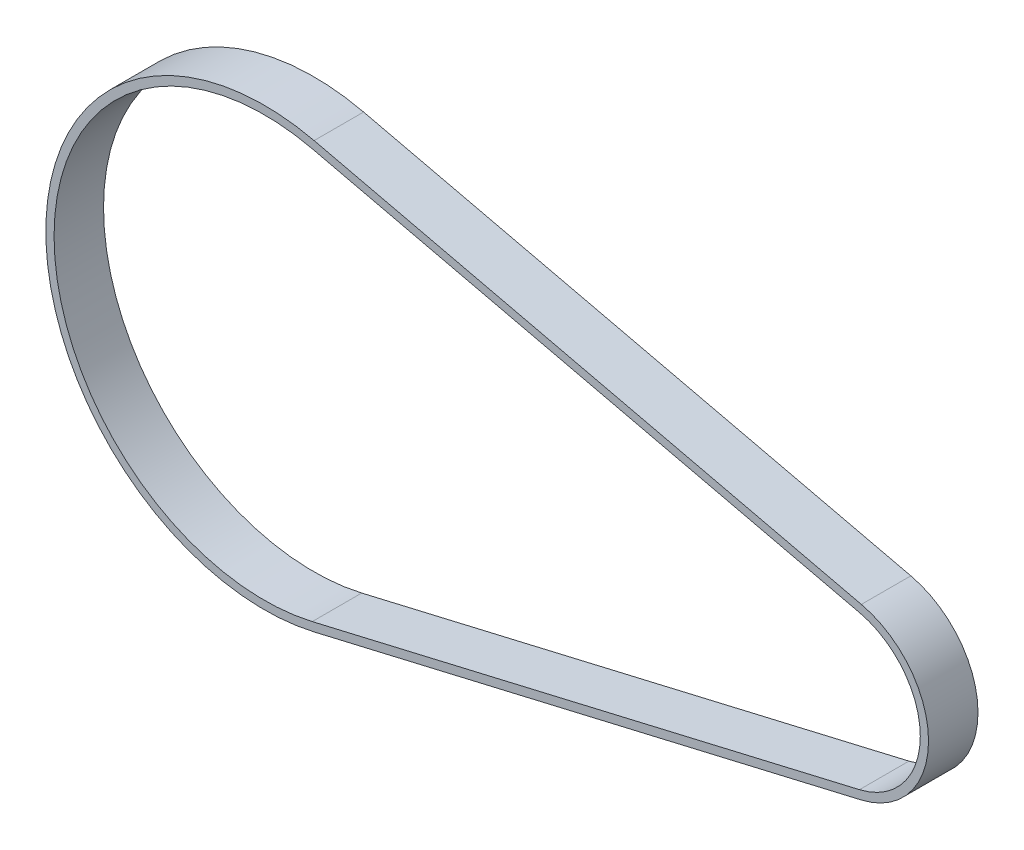
ISO-10303-21;
HEADER;
FILE_DESCRIPTION(('STEP AP214'),'2;1');
FILE_NAME('part.step','',(''),(''),'','','');
FILE_SCHEMA(('AUTOMOTIVE_DESIGN { 1 0 10303 214 1 1 1 1 }'));
ENDSEC;
DATA;
#1=APPLICATION_CONTEXT('core data for automotive mechanical design processes');
#2=APPLICATION_PROTOCOL_DEFINITION('international standard','automotive_design',2000,#1);
#3=PRODUCT_CONTEXT('',#1,'mechanical');
#4=PRODUCT('Part','Part','',(#3));
#5=PRODUCT_RELATED_PRODUCT_CATEGORY('part','',(#4));
#6=PRODUCT_DEFINITION_FORMATION('','',#4);
#7=PRODUCT_DEFINITION_CONTEXT('part definition',#1,'design');
#8=PRODUCT_DEFINITION('design','',#6,#7);
#9=PRODUCT_DEFINITION_SHAPE('','',#8);
#10=(LENGTH_UNIT() NAMED_UNIT(*) SI_UNIT(.MILLI.,.METRE.));
#11=(NAMED_UNIT(*) PLANE_ANGLE_UNIT() SI_UNIT($,.RADIAN.));
#12=(NAMED_UNIT(*) SI_UNIT($,.STERADIAN.) SOLID_ANGLE_UNIT());
#13=UNCERTAINTY_MEASURE_WITH_UNIT(LENGTH_MEASURE(1.E-05),#10,'distance_accuracy_value','');
#14=(GEOMETRIC_REPRESENTATION_CONTEXT(3) GLOBAL_UNCERTAINTY_ASSIGNED_CONTEXT((#13)) GLOBAL_UNIT_ASSIGNED_CONTEXT((#10,
#11,#12)) REPRESENTATION_CONTEXT('',''));
#15=CARTESIAN_POINT('',(0.,0.,0.));
#16=DIRECTION('',(0.,0.,1.));
#17=DIRECTION('',(1.,0.,0.));
#18=AXIS2_PLACEMENT_3D('',#15,#16,#17);
#19=CARTESIAN_POINT('',(0.,0.,6.));
#20=DIRECTION('',(0.,0.,1.));
#21=DIRECTION('',(1.,0.,0.));
#22=AXIS2_PLACEMENT_3D('',#19,#20,#21);
#23=PLANE('',#22);
#24=CARTESIAN_POINT('',(0.,0.,6.));
#25=DIRECTION('',(0.,0.,1.));
#26=DIRECTION('',(1.,0.,0.));
#27=AXIS2_PLACEMENT_3D('',#24,#25,#26);
#28=CIRCLE('',#27,26.5);
#29=CARTESIAN_POINT('',(6.03821428571428,25.8029061975545,6.));
#30=VERTEX_POINT('',#29);
#31=CARTESIAN_POINT('',(6.03821428571427,-25.8029061975545,6.));
#32=VERTEX_POINT('',#31);
#33=EDGE_CURVE('E136',#30,#32,#28,.T.);
#34=ORIENTED_EDGE('',*,*,#33,.T.);
#35=DIRECTION('',(0.973694573492622,0.227857142857143,0.));
#36=VECTOR('',#35,1.);
#37=CARTESIAN_POINT('',(72.4038928571429,-10.2724777503472,6.));
#38=LINE('',#37,#36);
#39=CARTESIAN_POINT('',(72.4038928571429,-10.2724777503472,6.));
#40=VERTEX_POINT('',#39);
#41=EDGE_CURVE('E139',#32,#40,#38,.T.);
#42=ORIENTED_EDGE('',*,*,#41,.T.);
#43=CARTESIAN_POINT('',(70.,0.,6.));
#44=DIRECTION('',(0.,0.,1.));
#45=DIRECTION('',(1.,0.,0.));
#46=AXIS2_PLACEMENT_3D('',#43,#44,#45);
#47=CIRCLE('',#46,10.55);
#48=CARTESIAN_POINT('',(72.4038928571429,10.2724777503472,6.));
#49=VERTEX_POINT('',#48);
#50=EDGE_CURVE('E142',#40,#49,#47,.T.);
#51=ORIENTED_EDGE('',*,*,#50,.T.);
#52=DIRECTION('',(-0.973694573492622,0.227857142857143,0.));
#53=VECTOR('',#52,1.);
#54=CARTESIAN_POINT('',(6.03821428571428,25.8029061975545,6.));
#55=LINE('',#54,#53);
#56=EDGE_CURVE('E144',#49,#30,#55,.T.);
#57=ORIENTED_EDGE('',*,*,#56,.T.);
#58=EDGE_LOOP('',(#34,#42,#51,#57));
#59=FACE_BOUND('',#58,.T.);
#60=DIRECTION('',(0.973694573492622,0.227857142857143,0.));
#61=VECTOR('',#60,1.);
#62=CARTESIAN_POINT('',(72.1760357142857,-9.29878317685455,6.));
#63=LINE('',#62,#61);
#64=CARTESIAN_POINT('',(5.81035714285714,-24.8292116240619,6.));
#65=VERTEX_POINT('',#64);
#66=CARTESIAN_POINT('',(72.1760357142857,-9.29878317685454,6.));
#67=VERTEX_POINT('',#66);
#68=EDGE_CURVE('E108',#65,#67,#63,.T.);
#69=ORIENTED_EDGE('',*,*,#68,.F.);
#70=CARTESIAN_POINT('',(0.,0.,6.));
#71=DIRECTION('',(0.,0.,1.));
#72=DIRECTION('',(1.,0.,0.));
#73=AXIS2_PLACEMENT_3D('',#70,#71,#72);
#74=CIRCLE('',#73,25.5);
#75=CARTESIAN_POINT('',(5.81035714285714,24.8292116240619,6.));
#76=VERTEX_POINT('',#75);
#77=EDGE_CURVE('E100',#76,#65,#74,.T.);
#78=ORIENTED_EDGE('',*,*,#77,.F.);
#79=DIRECTION('',(-0.973694573492622,0.227857142857143,0.));
#80=VECTOR('',#79,1.);
#81=CARTESIAN_POINT('',(5.81035714285714,24.8292116240619,6.));
#82=LINE('',#81,#80);
#83=CARTESIAN_POINT('',(72.1760357142857,9.29878317685454,6.));
#84=VERTEX_POINT('',#83);
#85=EDGE_CURVE('E122',#84,#76,#82,.T.);
#86=ORIENTED_EDGE('',*,*,#85,.F.);
#87=CARTESIAN_POINT('',(70.,0.,6.));
#88=DIRECTION('',(0.,0.,1.));
#89=DIRECTION('',(1.,0.,0.));
#90=AXIS2_PLACEMENT_3D('',#87,#88,#89);
#91=CIRCLE('',#90,9.55);
#92=EDGE_CURVE('E120',#67,#84,#91,.T.);
#93=ORIENTED_EDGE('',*,*,#92,.F.);
#94=EDGE_LOOP('',(#69,#78,#86,#93));
#95=FACE_BOUND('',#94,.T.);
#96=ADVANCED_FACE('F35',(#59,#95),#23,.T.);
#97=CARTESIAN_POINT('',(0.,0.,0.));
#98=DIRECTION('',(0.,0.,1.));
#99=DIRECTION('',(1.,0.,0.));
#100=AXIS2_PLACEMENT_3D('',#97,#98,#99);
#101=PLANE('',#100);
#102=CARTESIAN_POINT('',(0.,0.,0.));
#103=DIRECTION('',(0.,0.,1.));
#104=DIRECTION('',(1.,0.,0.));
#105=AXIS2_PLACEMENT_3D('',#102,#103,#104);
#106=CIRCLE('',#105,26.5);
#107=CARTESIAN_POINT('',(6.03821428571428,25.8029061975545,0.));
#108=VERTEX_POINT('',#107);
#109=CARTESIAN_POINT('',(6.03821428571427,-25.8029061975545,0.));
#110=VERTEX_POINT('',#109);
#111=EDGE_CURVE('E116',#108,#110,#106,.T.);
#112=ORIENTED_EDGE('',*,*,#111,.F.);
#113=DIRECTION('',(-0.973694573492622,0.227857142857143,0.));
#114=VECTOR('',#113,1.);
#115=CARTESIAN_POINT('',(6.03821428571428,25.8029061975545,0.));
#116=LINE('',#115,#114);
#117=CARTESIAN_POINT('',(72.4038928571429,10.2724777503472,0.));
#118=VERTEX_POINT('',#117);
#119=EDGE_CURVE('E140',#118,#108,#116,.T.);
#120=ORIENTED_EDGE('',*,*,#119,.F.);
#121=CARTESIAN_POINT('',(70.,0.,0.));
#122=DIRECTION('',(0.,0.,1.));
#123=DIRECTION('',(1.,0.,0.));
#124=AXIS2_PLACEMENT_3D('',#121,#122,#123);
#125=CIRCLE('',#124,10.55);
#126=CARTESIAN_POINT('',(72.4038928571429,-10.2724777503472,0.));
#127=VERTEX_POINT('',#126);
#128=EDGE_CURVE('E151',#127,#118,#125,.T.);
#129=ORIENTED_EDGE('',*,*,#128,.F.);
#130=DIRECTION('',(0.973694573492622,0.227857142857143,0.));
#131=VECTOR('',#130,1.);
#132=CARTESIAN_POINT('',(72.4038928571429,-10.2724777503472,0.));
#133=LINE('',#132,#131);
#134=EDGE_CURVE('E149',#110,#127,#133,.T.);
#135=ORIENTED_EDGE('',*,*,#134,.F.);
#136=EDGE_LOOP('',(#112,#120,#129,#135));
#137=FACE_BOUND('',#136,.T.);
#138=CARTESIAN_POINT('',(0.,0.,0.));
#139=DIRECTION('',(0.,0.,1.));
#140=DIRECTION('',(1.,0.,0.));
#141=AXIS2_PLACEMENT_3D('',#138,#139,#140);
#142=CIRCLE('',#141,25.5);
#143=CARTESIAN_POINT('',(5.81035714285714,24.8292116240619,0.));
#144=VERTEX_POINT('',#143);
#145=CARTESIAN_POINT('',(5.81035714285714,-24.8292116240619,0.));
#146=VERTEX_POINT('',#145);
#147=EDGE_CURVE('E58',#144,#146,#142,.T.);
#148=ORIENTED_EDGE('',*,*,#147,.T.);
#149=DIRECTION('',(0.973694573492622,0.227857142857143,0.));
#150=VECTOR('',#149,1.);
#151=CARTESIAN_POINT('',(72.1760357142857,-9.29878317685455,0.));
#152=LINE('',#151,#150);
#153=CARTESIAN_POINT('',(72.1760357142857,-9.29878317685454,0.));
#154=VERTEX_POINT('',#153);
#155=EDGE_CURVE('E115',#146,#154,#152,.T.);
#156=ORIENTED_EDGE('',*,*,#155,.T.);
#157=CARTESIAN_POINT('',(70.,0.,0.));
#158=DIRECTION('',(0.,0.,1.));
#159=DIRECTION('',(1.,0.,0.));
#160=AXIS2_PLACEMENT_3D('',#157,#158,#159);
#161=CIRCLE('',#160,9.55);
#162=CARTESIAN_POINT('',(72.1760357142857,9.29878317685454,0.));
#163=VERTEX_POINT('',#162);
#164=EDGE_CURVE('E128',#154,#163,#161,.T.);
#165=ORIENTED_EDGE('',*,*,#164,.T.);
#166=DIRECTION('',(-0.973694573492622,0.227857142857143,0.));
#167=VECTOR('',#166,1.);
#168=CARTESIAN_POINT('',(5.81035714285714,24.8292116240619,0.));
#169=LINE('',#168,#167);
#170=EDGE_CURVE('E109',#163,#144,#169,.T.);
#171=ORIENTED_EDGE('',*,*,#170,.T.);
#172=EDGE_LOOP('',(#148,#156,#165,#171));
#173=FACE_BOUND('',#172,.T.);
#174=ADVANCED_FACE('F169',(#137,#173),#101,.F.);
#175=CARTESIAN_POINT('',(0.,0.,6.));
#176=DIRECTION('',(0.,0.,-1.));
#177=DIRECTION('',(-1.,0.,0.));
#178=AXIS2_PLACEMENT_3D('',#175,#176,#177);
#179=CYLINDRICAL_SURFACE('',#178,26.5);
#180=ORIENTED_EDGE('',*,*,#111,.T.);
#181=DIRECTION('',(0.,0.,-1.));
#182=VECTOR('',#181,1.);
#183=CARTESIAN_POINT('',(6.03821428571427,-25.8029061975545,6.));
#184=LINE('',#183,#182);
#185=EDGE_CURVE('E11',#32,#110,#184,.T.);
#186=ORIENTED_EDGE('',*,*,#185,.F.);
#187=ORIENTED_EDGE('',*,*,#33,.F.);
#188=DIRECTION('',(0.,0.,-1.));
#189=VECTOR('',#188,1.);
#190=CARTESIAN_POINT('',(6.03821428571428,25.8029061975545,6.));
#191=LINE('',#190,#189);
#192=EDGE_CURVE('E146',#30,#108,#191,.T.);
#193=ORIENTED_EDGE('',*,*,#192,.T.);
#194=EDGE_LOOP('',(#180,#186,#187,#193));
#195=FACE_BOUND('',#194,.T.);
#196=ADVANCED_FACE('F37',(#195),#179,.T.);
#197=CARTESIAN_POINT('',(72.4038928571429,-10.2724777503472,6.));
#198=DIRECTION('',(-0.227857142857143,0.973694573492622,0.));
#199=DIRECTION('',(-0.973694573492622,-0.227857142857143,0.));
#200=AXIS2_PLACEMENT_3D('',#197,#198,#199);
#201=PLANE('',#200);
#202=ORIENTED_EDGE('',*,*,#134,.T.);
#203=DIRECTION('',(0.,0.,-1.));
#204=VECTOR('',#203,1.);
#205=CARTESIAN_POINT('',(72.4038928571429,-10.2724777503472,6.));
#206=LINE('',#205,#204);
#207=EDGE_CURVE('E43',#40,#127,#206,.T.);
#208=ORIENTED_EDGE('',*,*,#207,.F.);
#209=ORIENTED_EDGE('',*,*,#41,.F.);
#210=ORIENTED_EDGE('',*,*,#185,.T.);
#211=EDGE_LOOP('',(#202,#208,#209,#210));
#212=FACE_BOUND('',#211,.T.);
#213=ADVANCED_FACE('F179',(#212),#201,.F.);
#214=CARTESIAN_POINT('',(70.,0.,6.));
#215=DIRECTION('',(0.,0.,-1.));
#216=DIRECTION('',(-1.,0.,0.));
#217=AXIS2_PLACEMENT_3D('',#214,#215,#216);
#218=CYLINDRICAL_SURFACE('',#217,10.55);
#219=ORIENTED_EDGE('',*,*,#128,.T.);
#220=DIRECTION('',(0.,0.,-1.));
#221=VECTOR('',#220,1.);
#222=CARTESIAN_POINT('',(72.4038928571429,10.2724777503472,6.));
#223=LINE('',#222,#221);
#224=EDGE_CURVE('E156',#49,#118,#223,.T.);
#225=ORIENTED_EDGE('',*,*,#224,.F.);
#226=ORIENTED_EDGE('',*,*,#50,.F.);
#227=ORIENTED_EDGE('',*,*,#207,.T.);
#228=EDGE_LOOP('',(#219,#225,#226,#227));
#229=FACE_BOUND('',#228,.T.);
#230=ADVANCED_FACE('F163',(#229),#218,.T.);
#231=CARTESIAN_POINT('',(6.03821428571428,25.8029061975545,6.));
#232=DIRECTION('',(-0.227857142857143,-0.973694573492622,0.));
#233=DIRECTION('',(0.973694573492622,-0.227857142857143,0.));
#234=AXIS2_PLACEMENT_3D('',#231,#232,#233);
#235=PLANE('',#234);
#236=ORIENTED_EDGE('',*,*,#119,.T.);
#237=ORIENTED_EDGE('',*,*,#192,.F.);
#238=ORIENTED_EDGE('',*,*,#56,.F.);
#239=ORIENTED_EDGE('',*,*,#224,.T.);
#240=EDGE_LOOP('',(#236,#237,#238,#239));
#241=FACE_BOUND('',#240,.T.);
#242=ADVANCED_FACE('F173',(#241),#235,.F.);
#243=CARTESIAN_POINT('',(0.,0.,6.));
#244=DIRECTION('',(0.,0.,-1.));
#245=DIRECTION('',(-1.,0.,0.));
#246=AXIS2_PLACEMENT_3D('',#243,#244,#245);
#247=CYLINDRICAL_SURFACE('',#246,25.5);
#248=ORIENTED_EDGE('',*,*,#147,.F.);
#249=DIRECTION('',(0.,0.,-1.));
#250=VECTOR('',#249,1.);
#251=CARTESIAN_POINT('',(5.81035714285714,24.8292116240619,6.));
#252=LINE('',#251,#250);
#253=EDGE_CURVE('E104',#76,#144,#252,.T.);
#254=ORIENTED_EDGE('',*,*,#253,.F.);
#255=ORIENTED_EDGE('',*,*,#77,.T.);
#256=DIRECTION('',(0.,0.,-1.));
#257=VECTOR('',#256,1.);
#258=CARTESIAN_POINT('',(5.81035714285714,-24.8292116240619,6.));
#259=LINE('',#258,#257);
#260=EDGE_CURVE('E103',#65,#146,#259,.T.);
#261=ORIENTED_EDGE('',*,*,#260,.T.);
#262=EDGE_LOOP('',(#248,#254,#255,#261));
#263=FACE_BOUND('',#262,.T.);
#264=ADVANCED_FACE('F102',(#263),#247,.F.);
#265=CARTESIAN_POINT('',(72.1760357142857,-9.29878317685455,6.));
#266=DIRECTION('',(-0.227857142857143,0.973694573492622,0.));
#267=DIRECTION('',(-0.973694573492622,-0.227857142857143,0.));
#268=AXIS2_PLACEMENT_3D('',#265,#266,#267);
#269=PLANE('',#268);
#270=ORIENTED_EDGE('',*,*,#155,.F.);
#271=ORIENTED_EDGE('',*,*,#260,.F.);
#272=ORIENTED_EDGE('',*,*,#68,.T.);
#273=DIRECTION('',(0.,0.,-1.));
#274=VECTOR('',#273,1.);
#275=CARTESIAN_POINT('',(72.1760357142857,-9.29878317685454,6.));
#276=LINE('',#275,#274);
#277=EDGE_CURVE('E117',#67,#154,#276,.T.);
#278=ORIENTED_EDGE('',*,*,#277,.T.);
#279=EDGE_LOOP('',(#270,#271,#272,#278));
#280=FACE_BOUND('',#279,.T.);
#281=ADVANCED_FACE('F112',(#280),#269,.T.);
#282=CARTESIAN_POINT('',(70.,0.,6.));
#283=DIRECTION('',(0.,0.,-1.));
#284=DIRECTION('',(-1.,0.,0.));
#285=AXIS2_PLACEMENT_3D('',#282,#283,#284);
#286=CYLINDRICAL_SURFACE('',#285,9.55);
#287=ORIENTED_EDGE('',*,*,#164,.F.);
#288=ORIENTED_EDGE('',*,*,#277,.F.);
#289=ORIENTED_EDGE('',*,*,#92,.T.);
#290=DIRECTION('',(0.,0.,-1.));
#291=VECTOR('',#290,1.);
#292=CARTESIAN_POINT('',(72.1760357142857,9.29878317685454,6.));
#293=LINE('',#292,#291);
#294=EDGE_CURVE('E50',#84,#163,#293,.T.);
#295=ORIENTED_EDGE('',*,*,#294,.T.);
#296=EDGE_LOOP('',(#287,#288,#289,#295));
#297=FACE_BOUND('',#296,.T.);
#298=ADVANCED_FACE('F202',(#297),#286,.F.);
#299=CARTESIAN_POINT('',(5.81035714285714,24.8292116240619,6.));
#300=DIRECTION('',(-0.227857142857143,-0.973694573492622,0.));
#301=DIRECTION('',(0.973694573492622,-0.227857142857143,0.));
#302=AXIS2_PLACEMENT_3D('',#299,#300,#301);
#303=PLANE('',#302);
#304=ORIENTED_EDGE('',*,*,#170,.F.);
#305=ORIENTED_EDGE('',*,*,#294,.F.);
#306=ORIENTED_EDGE('',*,*,#85,.T.);
#307=ORIENTED_EDGE('',*,*,#253,.T.);
#308=EDGE_LOOP('',(#304,#305,#306,#307));
#309=FACE_BOUND('',#308,.T.);
#310=ADVANCED_FACE('F206',(#309),#303,.T.);
#311=CLOSED_SHELL('',(#96,#174,#196,#213,#230,#242,#264,#281,#298,#310));
#312=MANIFOLD_SOLID_BREP('B2',#311);
#313=ADVANCED_BREP_SHAPE_REPRESENTATION('',(#18,#312),#14);
#314=SHAPE_DEFINITION_REPRESENTATION(#9,#313);
ENDSEC;
END-ISO-10303-21;
